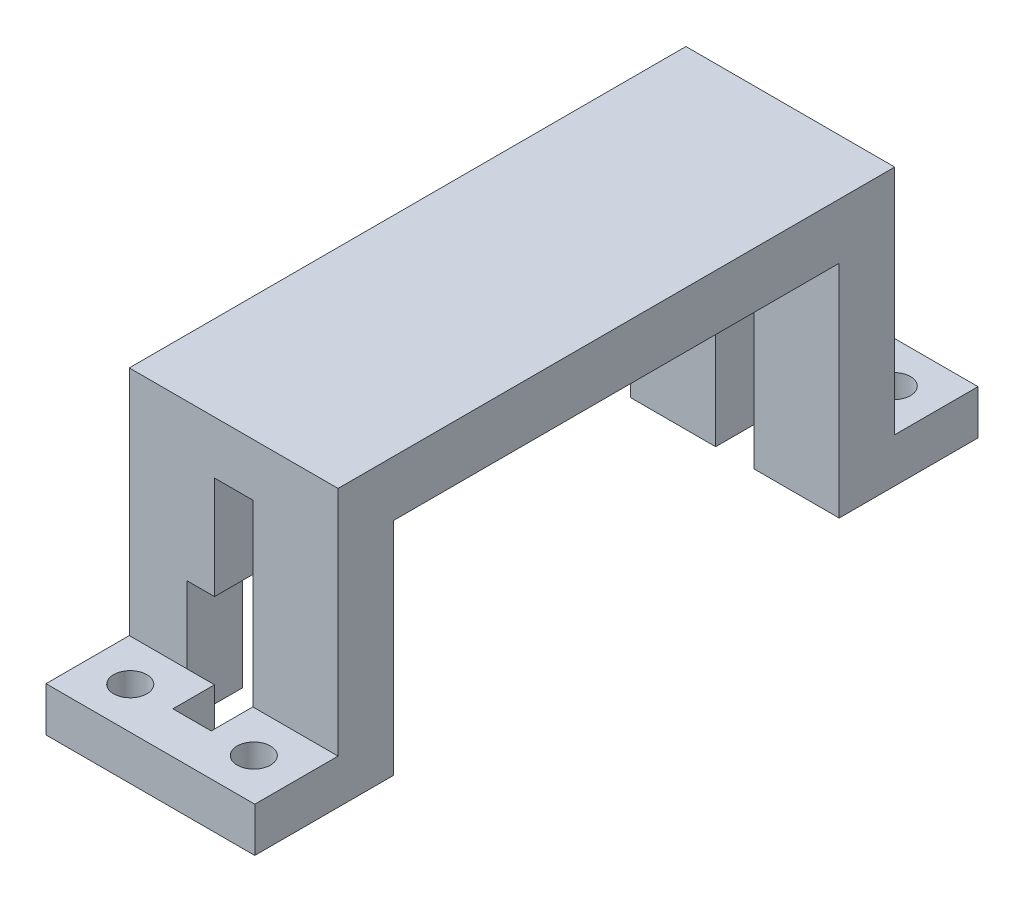
ISO-10303-21;
HEADER;
FILE_DESCRIPTION(('STEP AP214'),'2;1');
FILE_NAME('part.step','',(''),(''),'','','');
FILE_SCHEMA(('AUTOMOTIVE_DESIGN { 1 0 10303 214 1 1 1 1 }'));
ENDSEC;
DATA;
#1=APPLICATION_CONTEXT('core data for automotive mechanical design processes');
#2=APPLICATION_PROTOCOL_DEFINITION('international standard','automotive_design',2000,#1);
#3=PRODUCT_CONTEXT('',#1,'mechanical');
#4=PRODUCT('Part','Part','',(#3));
#5=PRODUCT_RELATED_PRODUCT_CATEGORY('part','',(#4));
#6=PRODUCT_DEFINITION_FORMATION('','',#4);
#7=PRODUCT_DEFINITION_CONTEXT('part definition',#1,'design');
#8=PRODUCT_DEFINITION('design','',#6,#7);
#9=PRODUCT_DEFINITION_SHAPE('','',#8);
#10=(LENGTH_UNIT() NAMED_UNIT(*) SI_UNIT(.MILLI.,.METRE.));
#11=(NAMED_UNIT(*) PLANE_ANGLE_UNIT() SI_UNIT($,.RADIAN.));
#12=(NAMED_UNIT(*) SI_UNIT($,.STERADIAN.) SOLID_ANGLE_UNIT());
#13=UNCERTAINTY_MEASURE_WITH_UNIT(LENGTH_MEASURE(1.E-05),#10,'distance_accuracy_value','');
#14=(GEOMETRIC_REPRESENTATION_CONTEXT(3) GLOBAL_UNCERTAINTY_ASSIGNED_CONTEXT((#13)) GLOBAL_UNIT_ASSIGNED_CONTEXT((#10,
#11,#12)) REPRESENTATION_CONTEXT('',''));
#15=CARTESIAN_POINT('',(0.,0.,0.));
#16=DIRECTION('',(0.,0.,1.));
#17=DIRECTION('',(1.,0.,0.));
#18=AXIS2_PLACEMENT_3D('',#15,#16,#17);
#19=CARTESIAN_POINT('',(7.675,-24.875,-32.5625));
#20=DIRECTION('',(-1.,0.,0.));
#21=DIRECTION('',(0.,0.,1.));
#22=AXIS2_PLACEMENT_3D('',#19,#20,#21);
#23=PLANE('',#22);
#24=DIRECTION('',(0.,0.,1.));
#25=VECTOR('',#24,1.);
#26=CARTESIAN_POINT('',(7.675,-24.875,-32.5625));
#27=LINE('',#26,#25);
#28=CARTESIAN_POINT('',(7.675,-24.875,25.0625));
#29=VERTEX_POINT('',#28);
#30=CARTESIAN_POINT('',(7.675,-24.875,28.8125));
#31=VERTEX_POINT('',#30);
#32=EDGE_CURVE('E416',#29,#31,#27,.T.);
#33=ORIENTED_EDGE('',*,*,#32,.F.);
#34=DIRECTION('',(0.,-1.,0.));
#35=VECTOR('',#34,1.);
#36=CARTESIAN_POINT('',(7.675,-15.75,25.0625));
#37=LINE('',#36,#35);
#38=CARTESIAN_POINT('',(7.675,-20.875,25.0625));
#39=VERTEX_POINT('',#38);
#40=EDGE_CURVE('E234',#39,#29,#37,.T.);
#41=ORIENTED_EDGE('',*,*,#40,.F.);
#42=DIRECTION('',(0.,0.,-1.));
#43=VECTOR('',#42,1.);
#44=CARTESIAN_POINT('',(7.675,-20.875,25.0625));
#45=LINE('',#44,#43);
#46=CARTESIAN_POINT('',(7.675,-20.875,28.8125));
#47=VERTEX_POINT('',#46);
#48=EDGE_CURVE('E312',#47,#39,#45,.T.);
#49=ORIENTED_EDGE('',*,*,#48,.F.);
#50=DIRECTION('',(0.,1.,0.));
#51=VECTOR('',#50,1.);
#52=CARTESIAN_POINT('',(7.675,-20.875,28.8125));
#53=LINE('',#52,#51);
#54=EDGE_CURVE('E504',#31,#47,#53,.T.);
#55=ORIENTED_EDGE('',*,*,#54,.F.);
#56=EDGE_LOOP('',(#33,#41,#49,#55));
#57=FACE_BOUND('',#56,.T.);
#58=ADVANCED_FACE('F43',(#57),#23,.F.);
#59=DIRECTION('',(0.,1.,0.));
#60=VECTOR('',#59,1.);
#61=CARTESIAN_POINT('',(7.675,0.,25.0625));
#62=LINE('',#61,#60);
#63=CARTESIAN_POINT('',(7.675,-14.,25.0625));
#64=VERTEX_POINT('',#63);
#65=CARTESIAN_POINT('',(7.675,-4.75000000000001,25.0625));
#66=VERTEX_POINT('',#65);
#67=EDGE_CURVE('E315',#64,#66,#62,.T.);
#68=ORIENTED_EDGE('',*,*,#67,.F.);
#69=DIRECTION('',(0.,0.,1.));
#70=VECTOR('',#69,1.);
#71=CARTESIAN_POINT('',(7.675,-14.,20.0625));
#72=LINE('',#71,#70);
#73=CARTESIAN_POINT('',(7.675,-14.,20.0625));
#74=VERTEX_POINT('',#73);
#75=EDGE_CURVE('E532',#74,#64,#72,.T.);
#76=ORIENTED_EDGE('',*,*,#75,.F.);
#77=DIRECTION('',(0.,-1.,0.));
#78=VECTOR('',#77,1.);
#79=CARTESIAN_POINT('',(7.675,-24.875,20.0625));
#80=LINE('',#79,#78);
#81=CARTESIAN_POINT('',(7.675,-5.,20.0625));
#82=VERTEX_POINT('',#81);
#83=EDGE_CURVE('E310',#82,#74,#80,.T.);
#84=ORIENTED_EDGE('',*,*,#83,.F.);
#85=DIRECTION('',(0.,0.,1.));
#86=VECTOR('',#85,1.);
#87=CARTESIAN_POINT('',(7.675,-5.,20.0625));
#88=LINE('',#87,#86);
#89=CARTESIAN_POINT('',(7.675,-5.,-20.0625));
#90=VERTEX_POINT('',#89);
#91=EDGE_CURVE('E301',#90,#82,#88,.T.);
#92=ORIENTED_EDGE('',*,*,#91,.F.);
#93=DIRECTION('',(0.,1.,0.));
#94=VECTOR('',#93,1.);
#95=CARTESIAN_POINT('',(7.675,-5.,-20.0625));
#96=LINE('',#95,#94);
#97=CARTESIAN_POINT('',(7.675,-24.875,-20.0625));
#98=VERTEX_POINT('',#97);
#99=EDGE_CURVE('E297',#98,#90,#96,.T.);
#100=ORIENTED_EDGE('',*,*,#99,.F.);
#101=CARTESIAN_POINT('',(7.675,-24.875,-28.8125));
#102=VERTEX_POINT('',#101);
#103=EDGE_CURVE('E412',#102,#98,#27,.T.);
#104=ORIENTED_EDGE('',*,*,#103,.F.);
#105=DIRECTION('',(0.,1.,0.));
#106=VECTOR('',#105,1.);
#107=CARTESIAN_POINT('',(7.675,-20.875,-28.8125));
#108=LINE('',#107,#106);
#109=CARTESIAN_POINT('',(7.675,-20.875,-28.8125));
#110=VERTEX_POINT('',#109);
#111=EDGE_CURVE('E291',#102,#110,#108,.T.);
#112=ORIENTED_EDGE('',*,*,#111,.T.);
#113=DIRECTION('',(0.,0.,-1.));
#114=VECTOR('',#113,1.);
#115=CARTESIAN_POINT('',(7.675,-20.875,-25.0625));
#116=LINE('',#115,#114);
#117=CARTESIAN_POINT('',(7.675,-20.875,-25.0625));
#118=VERTEX_POINT('',#117);
#119=EDGE_CURVE('E51',#118,#110,#116,.T.);
#120=ORIENTED_EDGE('',*,*,#119,.F.);
#121=DIRECTION('',(0.,-1.,0.));
#122=VECTOR('',#121,1.);
#123=CARTESIAN_POINT('',(7.675,-20.875,-25.0625));
#124=LINE('',#123,#122);
#125=CARTESIAN_POINT('',(7.675,-4.75000000000001,-25.0625));
#126=VERTEX_POINT('',#125);
#127=EDGE_CURVE('E287',#126,#118,#124,.T.);
#128=ORIENTED_EDGE('',*,*,#127,.F.);
#129=DIRECTION('',(0.,0.,1.));
#130=VECTOR('',#129,1.);
#131=CARTESIAN_POINT('',(7.675,-4.75000000000001,-32.5625));
#132=LINE('',#131,#130);
#133=EDGE_CURVE('E480',#126,#66,#132,.T.);
#134=ORIENTED_EDGE('',*,*,#133,.T.);
#135=EDGE_LOOP('',(#68,#76,#84,#92,#100,#104,#112,#120,#128,#134));
#136=FACE_BOUND('',#135,.T.);
#137=ADVANCED_FACE('F285',(#136),#23,.F.);
#138=CARTESIAN_POINT('',(11.125,-4.75000000000001,-32.5625));
#139=DIRECTION('',(1.,0.,0.));
#140=DIRECTION('',(0.,1.,0.));
#141=AXIS2_PLACEMENT_3D('',#138,#139,#140);
#142=PLANE('',#141);
#143=DIRECTION('',(0.,0.,1.));
#144=VECTOR('',#143,1.);
#145=CARTESIAN_POINT('',(11.125,-20.875,-25.0625));
#146=LINE('',#145,#144);
#147=CARTESIAN_POINT('',(11.125,-20.875,-28.8125));
#148=VERTEX_POINT('',#147);
#149=CARTESIAN_POINT('',(11.125,-20.875,-25.0625));
#150=VERTEX_POINT('',#149);
#151=EDGE_CURVE('E275',#148,#150,#146,.T.);
#152=ORIENTED_EDGE('',*,*,#151,.F.);
#153=DIRECTION('',(0.,1.,0.));
#154=VECTOR('',#153,1.);
#155=CARTESIAN_POINT('',(11.125,-20.875,-28.8125));
#156=LINE('',#155,#154);
#157=CARTESIAN_POINT('',(11.125,-24.875,-28.8125));
#158=VERTEX_POINT('',#157);
#159=EDGE_CURVE('E522',#158,#148,#156,.T.);
#160=ORIENTED_EDGE('',*,*,#159,.F.);
#161=DIRECTION('',(0.,0.,1.));
#162=VECTOR('',#161,1.);
#163=CARTESIAN_POINT('',(11.125,-24.875,-32.5625));
#164=LINE('',#163,#162);
#165=CARTESIAN_POINT('',(11.125,-24.875,-20.0625));
#166=VERTEX_POINT('',#165);
#167=EDGE_CURVE('E452',#158,#166,#164,.T.);
#168=ORIENTED_EDGE('',*,*,#167,.T.);
#169=DIRECTION('',(0.,-1.,0.));
#170=VECTOR('',#169,1.);
#171=CARTESIAN_POINT('',(11.125,-5.,-20.0625));
#172=LINE('',#171,#170);
#173=CARTESIAN_POINT('',(11.125,-5.,-20.0625));
#174=VERTEX_POINT('',#173);
#175=EDGE_CURVE('E454',#174,#166,#172,.T.);
#176=ORIENTED_EDGE('',*,*,#175,.F.);
#177=DIRECTION('',(0.,0.,-1.));
#178=VECTOR('',#177,1.);
#179=CARTESIAN_POINT('',(11.125,-5.,20.0625));
#180=LINE('',#179,#178);
#181=CARTESIAN_POINT('',(11.125,-5.,20.0625));
#182=VERTEX_POINT('',#181);
#183=EDGE_CURVE('E457',#182,#174,#180,.T.);
#184=ORIENTED_EDGE('',*,*,#183,.F.);
#185=DIRECTION('',(0.,1.,0.));
#186=VECTOR('',#185,1.);
#187=CARTESIAN_POINT('',(11.125,-24.875,20.0625));
#188=LINE('',#187,#186);
#189=CARTESIAN_POINT('',(11.125,-24.875,20.0625));
#190=VERTEX_POINT('',#189);
#191=EDGE_CURVE('E459',#190,#182,#188,.T.);
#192=ORIENTED_EDGE('',*,*,#191,.F.);
#193=CARTESIAN_POINT('',(11.125,-24.875,28.8125));
#194=VERTEX_POINT('',#193);
#195=EDGE_CURVE('E485',#190,#194,#164,.T.);
#196=ORIENTED_EDGE('',*,*,#195,.T.);
#197=DIRECTION('',(0.,1.,0.));
#198=VECTOR('',#197,1.);
#199=CARTESIAN_POINT('',(11.125,-20.875,28.8125));
#200=LINE('',#199,#198);
#201=CARTESIAN_POINT('',(11.125,-20.875,28.8125));
#202=VERTEX_POINT('',#201);
#203=EDGE_CURVE('E475',#194,#202,#200,.T.);
#204=ORIENTED_EDGE('',*,*,#203,.T.);
#205=DIRECTION('',(0.,0.,1.));
#206=VECTOR('',#205,1.);
#207=CARTESIAN_POINT('',(11.125,-20.875,25.0625));
#208=LINE('',#207,#206);
#209=CARTESIAN_POINT('',(11.125,-20.875,25.0625));
#210=VERTEX_POINT('',#209);
#211=EDGE_CURVE('E304',#210,#202,#208,.T.);
#212=ORIENTED_EDGE('',*,*,#211,.F.);
#213=DIRECTION('',(0.,-1.,0.));
#214=VECTOR('',#213,1.);
#215=CARTESIAN_POINT('',(11.125,0.,25.0625));
#216=LINE('',#215,#214);
#217=CARTESIAN_POINT('',(11.125,-4.75000000000001,25.0625));
#218=VERTEX_POINT('',#217);
#219=EDGE_CURVE('E298',#218,#210,#216,.T.);
#220=ORIENTED_EDGE('',*,*,#219,.F.);
#221=DIRECTION('',(0.,0.,1.));
#222=VECTOR('',#221,1.);
#223=CARTESIAN_POINT('',(11.125,-4.75000000000001,-32.5625));
#224=LINE('',#223,#222);
#225=CARTESIAN_POINT('',(11.125,-4.75000000000001,-25.0625));
#226=VERTEX_POINT('',#225);
#227=EDGE_CURVE('E481',#226,#218,#224,.T.);
#228=ORIENTED_EDGE('',*,*,#227,.F.);
#229=DIRECTION('',(0.,1.,0.));
#230=VECTOR('',#229,1.);
#231=CARTESIAN_POINT('',(11.125,-20.875,-25.0625));
#232=LINE('',#231,#230);
#233=EDGE_CURVE('E415',#150,#226,#232,.T.);
#234=ORIENTED_EDGE('',*,*,#233,.F.);
#235=EDGE_LOOP('',(#152,#160,#168,#176,#184,#192,#196,#204,#212,#220,#228,#234));
#236=FACE_BOUND('',#235,.T.);
#237=ADVANCED_FACE('F471',(#236),#142,.F.);
#238=CARTESIAN_POINT('',(18.8,-24.875,20.0625));
#239=DIRECTION('',(0.,0.,1.));
#240=DIRECTION('',(0.,-1.,0.));
#241=AXIS2_PLACEMENT_3D('',#238,#239,#240);
#242=PLANE('',#241);
#243=ORIENTED_EDGE('',*,*,#83,.T.);
#244=DIRECTION('',(1.,0.,0.));
#245=VECTOR('',#244,1.);
#246=CARTESIAN_POINT('',(5.175,-14.,20.0625));
#247=LINE('',#246,#245);
#248=CARTESIAN_POINT('',(5.175,-14.,20.0625));
#249=VERTEX_POINT('',#248);
#250=EDGE_CURVE('E243',#249,#74,#247,.T.);
#251=ORIENTED_EDGE('',*,*,#250,.F.);
#252=DIRECTION('',(0.,1.,0.));
#253=VECTOR('',#252,1.);
#254=CARTESIAN_POINT('',(5.175,-24.875,20.0625));
#255=LINE('',#254,#253);
#256=CARTESIAN_POINT('',(5.175,-24.875,20.0625));
#257=VERTEX_POINT('',#256);
#258=EDGE_CURVE('E228',#257,#249,#255,.T.);
#259=ORIENTED_EDGE('',*,*,#258,.F.);
#260=DIRECTION('',(-1.,0.,0.));
#261=VECTOR('',#260,1.);
#262=CARTESIAN_POINT('',(18.8,-24.875,20.0625));
#263=LINE('',#262,#261);
#264=CARTESIAN_POINT('',(0.,-24.875,20.0625));
#265=VERTEX_POINT('',#264);
#266=EDGE_CURVE('E241',#257,#265,#263,.T.);
#267=ORIENTED_EDGE('',*,*,#266,.T.);
#268=DIRECTION('',(0.,1.,0.));
#269=VECTOR('',#268,1.);
#270=CARTESIAN_POINT('',(0.,-24.875,20.0625));
#271=LINE('',#270,#269);
#272=CARTESIAN_POINT('',(0.,-5.,20.0625));
#273=VERTEX_POINT('',#272);
#274=EDGE_CURVE('E358',#265,#273,#271,.T.);
#275=ORIENTED_EDGE('',*,*,#274,.T.);
#276=DIRECTION('',(-1.,0.,0.));
#277=VECTOR('',#276,1.);
#278=CARTESIAN_POINT('',(18.8,-5.,20.0625));
#279=LINE('',#278,#277);
#280=EDGE_CURVE('E257',#82,#273,#279,.T.);
#281=ORIENTED_EDGE('',*,*,#280,.F.);
#282=EDGE_LOOP('',(#243,#251,#259,#267,#275,#281));
#283=FACE_BOUND('',#282,.T.);
#284=ADVANCED_FACE('F239',(#283),#242,.F.);
#285=CARTESIAN_POINT('',(18.8,-5.,20.0625));
#286=DIRECTION('',(0.,1.,0.));
#287=DIRECTION('',(0.,0.,1.));
#288=AXIS2_PLACEMENT_3D('',#285,#286,#287);
#289=PLANE('',#288);
#290=DIRECTION('',(-1.,0.,0.));
#291=VECTOR('',#290,1.);
#292=CARTESIAN_POINT('',(18.8,-5.,-20.0625));
#293=LINE('',#292,#291);
#294=CARTESIAN_POINT('',(0.,-5.,-20.0625));
#295=VERTEX_POINT('',#294);
#296=EDGE_CURVE('E383',#90,#295,#293,.T.);
#297=ORIENTED_EDGE('',*,*,#296,.F.);
#298=ORIENTED_EDGE('',*,*,#91,.T.);
#299=ORIENTED_EDGE('',*,*,#280,.T.);
#300=DIRECTION('',(0.,0.,-1.));
#301=VECTOR('',#300,1.);
#302=CARTESIAN_POINT('',(0.,-5.,20.0625));
#303=LINE('',#302,#301);
#304=EDGE_CURVE('E360',#273,#295,#303,.T.);
#305=ORIENTED_EDGE('',*,*,#304,.T.);
#306=EDGE_LOOP('',(#297,#298,#299,#305));
#307=FACE_BOUND('',#306,.T.);
#308=ADVANCED_FACE('F398',(#307),#289,.F.);
#309=CARTESIAN_POINT('',(18.8,-5.,-20.0625));
#310=DIRECTION('',(0.,0.,-1.));
#311=DIRECTION('',(0.,1.,0.));
#312=AXIS2_PLACEMENT_3D('',#309,#310,#311);
#313=PLANE('',#312);
#314=DIRECTION('',(-1.,0.,0.));
#315=VECTOR('',#314,1.);
#316=CARTESIAN_POINT('',(18.8,-24.875,-20.0625));
#317=LINE('',#316,#315);
#318=CARTESIAN_POINT('',(0.,-24.875,-20.0625));
#319=VERTEX_POINT('',#318);
#320=EDGE_CURVE('E380',#98,#319,#317,.T.);
#321=ORIENTED_EDGE('',*,*,#320,.F.);
#322=ORIENTED_EDGE('',*,*,#99,.T.);
#323=ORIENTED_EDGE('',*,*,#296,.T.);
#324=DIRECTION('',(0.,-1.,0.));
#325=VECTOR('',#324,1.);
#326=CARTESIAN_POINT('',(0.,-5.,-20.0625));
#327=LINE('',#326,#325);
#328=EDGE_CURVE('E363',#295,#319,#327,.T.);
#329=ORIENTED_EDGE('',*,*,#328,.T.);
#330=EDGE_LOOP('',(#321,#322,#323,#329));
#331=FACE_BOUND('',#330,.T.);
#332=ADVANCED_FACE('F393',(#331),#313,.F.);
#333=CARTESIAN_POINT('',(18.8,-20.875,-25.0625));
#334=DIRECTION('',(0.,0.,1.));
#335=DIRECTION('',(0.,-1.,0.));
#336=AXIS2_PLACEMENT_3D('',#333,#334,#335);
#337=PLANE('',#336);
#338=DIRECTION('',(-1.,0.,0.));
#339=VECTOR('',#338,1.);
#340=CARTESIAN_POINT('',(18.8,-4.75000000000001,-25.0625));
#341=LINE('',#340,#339);
#342=EDGE_CURVE('E296',#226,#126,#341,.T.);
#343=ORIENTED_EDGE('',*,*,#342,.T.);
#344=ORIENTED_EDGE('',*,*,#127,.T.);
#345=DIRECTION('',(-1.,0.,0.));
#346=VECTOR('',#345,1.);
#347=CARTESIAN_POINT('',(18.8,-20.875,-25.0625));
#348=LINE('',#347,#346);
#349=CARTESIAN_POINT('',(0.,-20.875,-25.0625));
#350=VERTEX_POINT('',#349);
#351=EDGE_CURVE('E280',#118,#350,#348,.T.);
#352=ORIENTED_EDGE('',*,*,#351,.T.);
#353=DIRECTION('',(0.,1.,0.));
#354=VECTOR('',#353,1.);
#355=CARTESIAN_POINT('',(0.,-20.875,-25.0625));
#356=LINE('',#355,#354);
#357=CARTESIAN_POINT('',(0.,0.,-25.0625));
#358=VERTEX_POINT('',#357);
#359=EDGE_CURVE('E318',#350,#358,#356,.T.);
#360=ORIENTED_EDGE('',*,*,#359,.T.);
#361=DIRECTION('',(-1.,0.,0.));
#362=VECTOR('',#361,1.);
#363=CARTESIAN_POINT('',(18.8,0.,-25.0625));
#364=LINE('',#363,#362);
#365=CARTESIAN_POINT('',(18.8,0.,-25.0625));
#366=VERTEX_POINT('',#365);
#367=EDGE_CURVE('E272',#366,#358,#364,.T.);
#368=ORIENTED_EDGE('',*,*,#367,.F.);
#369=DIRECTION('',(0.,1.,0.));
#370=VECTOR('',#369,1.);
#371=CARTESIAN_POINT('',(18.8,-20.875,-25.0625));
#372=LINE('',#371,#370);
#373=CARTESIAN_POINT('',(18.8,-20.875,-25.0625));
#374=VERTEX_POINT('',#373);
#375=EDGE_CURVE('E319',#374,#366,#372,.T.);
#376=ORIENTED_EDGE('',*,*,#375,.F.);
#377=EDGE_CURVE('E373',#374,#150,#348,.T.);
#378=ORIENTED_EDGE('',*,*,#377,.T.);
#379=ORIENTED_EDGE('',*,*,#233,.T.);
#380=EDGE_LOOP('',(#343,#344,#352,#360,#368,#376,#378,#379));
#381=FACE_BOUND('',#380,.T.);
#382=ADVANCED_FACE('F45',(#381),#337,.F.);
#383=CARTESIAN_POINT('',(18.8,0.,25.0625));
#384=DIRECTION('',(0.,-1.,0.));
#385=DIRECTION('',(0.,0.,-1.));
#386=AXIS2_PLACEMENT_3D('',#383,#384,#385);
#387=PLANE('',#386);
#388=DIRECTION('',(0.,0.,1.));
#389=VECTOR('',#388,1.);
#390=CARTESIAN_POINT('',(0.,0.,25.0625));
#391=LINE('',#390,#389);
#392=CARTESIAN_POINT('',(0.,0.,25.0625));
#393=VERTEX_POINT('',#392);
#394=EDGE_CURVE('E346',#358,#393,#391,.T.);
#395=ORIENTED_EDGE('',*,*,#394,.T.);
#396=DIRECTION('',(-1.,0.,0.));
#397=VECTOR('',#396,1.);
#398=CARTESIAN_POINT('',(18.8,0.,25.0625));
#399=LINE('',#398,#397);
#400=CARTESIAN_POINT('',(18.8,0.,25.0625));
#401=VERTEX_POINT('',#400);
#402=EDGE_CURVE('E268',#401,#393,#399,.T.);
#403=ORIENTED_EDGE('',*,*,#402,.F.);
#404=DIRECTION('',(0.,0.,1.));
#405=VECTOR('',#404,1.);
#406=CARTESIAN_POINT('',(18.8,0.,25.0625));
#407=LINE('',#406,#405);
#408=EDGE_CURVE('E322',#366,#401,#407,.T.);
#409=ORIENTED_EDGE('',*,*,#408,.F.);
#410=ORIENTED_EDGE('',*,*,#367,.T.);
#411=EDGE_LOOP('',(#395,#403,#409,#410));
#412=FACE_BOUND('',#411,.T.);
#413=ADVANCED_FACE('F441',(#412),#387,.F.);
#414=CARTESIAN_POINT('',(18.8,0.,25.0625));
#415=DIRECTION('',(0.,0.,-1.));
#416=DIRECTION('',(0.,1.,0.));
#417=AXIS2_PLACEMENT_3D('',#414,#415,#416);
#418=PLANE('',#417);
#419=DIRECTION('',(0.,-1.,0.));
#420=VECTOR('',#419,1.);
#421=CARTESIAN_POINT('',(5.175,-14.,25.0625));
#422=LINE('',#421,#420);
#423=CARTESIAN_POINT('',(5.175,-14.,25.0625));
#424=VERTEX_POINT('',#423);
#425=CARTESIAN_POINT('',(5.175,-20.875,25.0625));
#426=VERTEX_POINT('',#425);
#427=EDGE_CURVE('E528',#424,#426,#422,.T.);
#428=ORIENTED_EDGE('',*,*,#427,.F.);
#429=DIRECTION('',(1.,0.,0.));
#430=VECTOR('',#429,1.);
#431=CARTESIAN_POINT('',(5.175,-14.,25.0625));
#432=LINE('',#431,#430);
#433=EDGE_CURVE('E527',#424,#64,#432,.T.);
#434=ORIENTED_EDGE('',*,*,#433,.T.);
#435=ORIENTED_EDGE('',*,*,#67,.T.);
#436=DIRECTION('',(1.,0.,0.));
#437=VECTOR('',#436,1.);
#438=CARTESIAN_POINT('',(18.8,-4.75000000000001,25.0625));
#439=LINE('',#438,#437);
#440=EDGE_CURVE('E11',#66,#218,#439,.T.);
#441=ORIENTED_EDGE('',*,*,#440,.T.);
#442=ORIENTED_EDGE('',*,*,#219,.T.);
#443=DIRECTION('',(-1.,0.,0.));
#444=VECTOR('',#443,1.);
#445=CARTESIAN_POINT('',(18.8,-20.875,25.0625));
#446=LINE('',#445,#444);
#447=CARTESIAN_POINT('',(18.8,-20.875,25.0625));
#448=VERTEX_POINT('',#447);
#449=EDGE_CURVE('E265',#448,#210,#446,.T.);
#450=ORIENTED_EDGE('',*,*,#449,.F.);
#451=DIRECTION('',(0.,-1.,0.));
#452=VECTOR('',#451,1.);
#453=CARTESIAN_POINT('',(18.8,0.,25.0625));
#454=LINE('',#453,#452);
#455=EDGE_CURVE('E325',#401,#448,#454,.T.);
#456=ORIENTED_EDGE('',*,*,#455,.F.);
#457=ORIENTED_EDGE('',*,*,#402,.T.);
#458=DIRECTION('',(0.,-1.,0.));
#459=VECTOR('',#458,1.);
#460=CARTESIAN_POINT('',(0.,0.,25.0625));
#461=LINE('',#460,#459);
#462=CARTESIAN_POINT('',(0.,-20.875,25.0625));
#463=VERTEX_POINT('',#462);
#464=EDGE_CURVE('E348',#393,#463,#461,.T.);
#465=ORIENTED_EDGE('',*,*,#464,.T.);
#466=EDGE_CURVE('E264',#426,#463,#446,.T.);
#467=ORIENTED_EDGE('',*,*,#466,.F.);
#468=EDGE_LOOP('',(#428,#434,#435,#441,#442,#450,#456,#457,#465,#467));
#469=FACE_BOUND('',#468,.T.);
#470=ADVANCED_FACE('F436',(#469),#418,.F.);
#471=CARTESIAN_POINT('',(18.8,-20.875,25.0625));
#472=DIRECTION('',(0.,-1.,0.));
#473=DIRECTION('',(0.,0.,-1.));
#474=AXIS2_PLACEMENT_3D('',#471,#472,#473);
#475=PLANE('',#474);
#476=CARTESIAN_POINT('',(14.9625,-20.875,28.8125));
#477=DIRECTION('',(0.,1.,0.));
#478=DIRECTION('',(0.,0.,1.));
#479=AXIS2_PLACEMENT_3D('',#476,#477,#478);
#480=CIRCLE('',#479,1.5);
#481=CARTESIAN_POINT('',(14.9625,-20.875,30.3125));
#482=VERTEX_POINT('',#481);
#483=EDGE_CURVE('E494',#482,#482,#480,.T.);
#484=ORIENTED_EDGE('',*,*,#483,.F.);
#485=EDGE_LOOP('',(#484));
#486=FACE_BOUND('',#485,.T.);
#487=ORIENTED_EDGE('',*,*,#449,.T.);
#488=ORIENTED_EDGE('',*,*,#211,.T.);
#489=DIRECTION('',(-1.,0.,0.));
#490=VECTOR('',#489,1.);
#491=CARTESIAN_POINT('',(18.802,-20.875,28.8125));
#492=LINE('',#491,#490);
#493=EDGE_CURVE('E467',#202,#47,#492,.T.);
#494=ORIENTED_EDGE('',*,*,#493,.T.);
#495=ORIENTED_EDGE('',*,*,#48,.T.);
#496=EDGE_CURVE('E269',#39,#426,#446,.T.);
#497=ORIENTED_EDGE('',*,*,#496,.T.);
#498=ORIENTED_EDGE('',*,*,#466,.T.);
#499=DIRECTION('',(0.,0.,1.));
#500=VECTOR('',#499,1.);
#501=CARTESIAN_POINT('',(0.,-20.875,25.0625));
#502=LINE('',#501,#500);
#503=CARTESIAN_POINT('',(0.,-20.875,32.5625));
#504=VERTEX_POINT('',#503);
#505=EDGE_CURVE('E351',#463,#504,#502,.T.);
#506=ORIENTED_EDGE('',*,*,#505,.T.);
#507=DIRECTION('',(-1.,0.,0.));
#508=VECTOR('',#507,1.);
#509=CARTESIAN_POINT('',(18.8,-20.875,32.5625));
#510=LINE('',#509,#508);
#511=CARTESIAN_POINT('',(18.8,-20.875,32.5625));
#512=VERTEX_POINT('',#511);
#513=EDGE_CURVE('E262',#512,#504,#510,.T.);
#514=ORIENTED_EDGE('',*,*,#513,.F.);
#515=DIRECTION('',(0.,0.,1.));
#516=VECTOR('',#515,1.);
#517=CARTESIAN_POINT('',(18.8,-20.875,25.0625));
#518=LINE('',#517,#516);
#519=EDGE_CURVE('E327',#448,#512,#518,.T.);
#520=ORIENTED_EDGE('',*,*,#519,.F.);
#521=EDGE_LOOP('',(#487,#488,#494,#495,#497,#498,#506,#514,#520));
#522=FACE_BOUND('',#521,.T.);
#523=CARTESIAN_POINT('',(3.8375,-20.875,28.8125));
#524=DIRECTION('',(0.,1.,0.));
#525=DIRECTION('',(0.,0.,1.));
#526=AXIS2_PLACEMENT_3D('',#523,#524,#525);
#527=CIRCLE('',#526,1.5);
#528=CARTESIAN_POINT('',(3.8375,-20.875,30.3125));
#529=VERTEX_POINT('',#528);
#530=EDGE_CURVE('E490',#529,#529,#527,.T.);
#531=ORIENTED_EDGE('',*,*,#530,.F.);
#532=EDGE_LOOP('',(#531));
#533=FACE_BOUND('',#532,.T.);
#534=ADVANCED_FACE('F429',(#486,#522,#533),#475,.F.);
#535=CARTESIAN_POINT('',(18.8,-24.875,32.5625));
#536=DIRECTION('',(0.,0.,-1.));
#537=DIRECTION('',(0.,1.,0.));
#538=AXIS2_PLACEMENT_3D('',#535,#536,#537);
#539=PLANE('',#538);
#540=ORIENTED_EDGE('',*,*,#513,.T.);
#541=DIRECTION('',(0.,-1.,0.));
#542=VECTOR('',#541,1.);
#543=CARTESIAN_POINT('',(0.,-24.875,32.5625));
#544=LINE('',#543,#542);
#545=CARTESIAN_POINT('',(0.,-24.875,32.5625));
#546=VERTEX_POINT('',#545);
#547=EDGE_CURVE('E354',#504,#546,#544,.T.);
#548=ORIENTED_EDGE('',*,*,#547,.T.);
#549=DIRECTION('',(-1.,0.,0.));
#550=VECTOR('',#549,1.);
#551=CARTESIAN_POINT('',(18.8,-24.875,32.5625));
#552=LINE('',#551,#550);
#553=CARTESIAN_POINT('',(18.8,-24.875,32.5625));
#554=VERTEX_POINT('',#553);
#555=EDGE_CURVE('E255',#554,#546,#552,.T.);
#556=ORIENTED_EDGE('',*,*,#555,.F.);
#557=DIRECTION('',(0.,-1.,0.));
#558=VECTOR('',#557,1.);
#559=CARTESIAN_POINT('',(18.8,-24.875,32.5625));
#560=LINE('',#559,#558);
#561=EDGE_CURVE('E329',#512,#554,#560,.T.);
#562=ORIENTED_EDGE('',*,*,#561,.F.);
#563=EDGE_LOOP('',(#540,#548,#556,#562));
#564=FACE_BOUND('',#563,.T.);
#565=ADVANCED_FACE('F423',(#564),#539,.F.);
#566=CARTESIAN_POINT('',(18.8,-24.875,25.0625));
#567=DIRECTION('',(0.,1.,0.));
#568=DIRECTION('',(0.,0.,1.));
#569=AXIS2_PLACEMENT_3D('',#566,#567,#568);
#570=PLANE('',#569);
#571=CARTESIAN_POINT('',(14.9625,-24.875,28.8125));
#572=DIRECTION('',(0.,1.,0.));
#573=DIRECTION('',(0.,0.,1.));
#574=AXIS2_PLACEMENT_3D('',#571,#572,#573);
#575=CIRCLE('',#574,1.5);
#576=CARTESIAN_POINT('',(14.9625,-24.875,30.3125));
#577=VERTEX_POINT('',#576);
#578=EDGE_CURVE('E508',#577,#577,#575,.F.);
#579=ORIENTED_EDGE('',*,*,#578,.F.);
#580=EDGE_LOOP('',(#579));
#581=FACE_BOUND('',#580,.T.);
#582=DIRECTION('',(0.,0.,-1.));
#583=VECTOR('',#582,1.);
#584=CARTESIAN_POINT('',(5.175,-24.875,25.0625));
#585=LINE('',#584,#583);
#586=CARTESIAN_POINT('',(5.175,-24.875,25.0625));
#587=VERTEX_POINT('',#586);
#588=EDGE_CURVE('E224',#587,#257,#585,.T.);
#589=ORIENTED_EDGE('',*,*,#588,.F.);
#590=DIRECTION('',(1.,0.,0.));
#591=VECTOR('',#590,1.);
#592=CARTESIAN_POINT('',(5.175,-24.875,25.0625));
#593=LINE('',#592,#591);
#594=EDGE_CURVE('E58',#587,#29,#593,.T.);
#595=ORIENTED_EDGE('',*,*,#594,.T.);
#596=ORIENTED_EDGE('',*,*,#32,.T.);
#597=DIRECTION('',(-1.,0.,0.));
#598=VECTOR('',#597,1.);
#599=CARTESIAN_POINT('',(18.802,-24.875,28.8125));
#600=LINE('',#599,#598);
#601=EDGE_CURVE('E516',#194,#31,#600,.T.);
#602=ORIENTED_EDGE('',*,*,#601,.F.);
#603=ORIENTED_EDGE('',*,*,#195,.F.);
#604=CARTESIAN_POINT('',(18.8,-24.875,20.0625));
#605=VERTEX_POINT('',#604);
#606=EDGE_CURVE('E251',#605,#190,#263,.T.);
#607=ORIENTED_EDGE('',*,*,#606,.F.);
#608=DIRECTION('',(0.,0.,-1.));
#609=VECTOR('',#608,1.);
#610=CARTESIAN_POINT('',(18.8,-24.875,25.0625));
#611=LINE('',#610,#609);
#612=EDGE_CURVE('E331',#554,#605,#611,.T.);
#613=ORIENTED_EDGE('',*,*,#612,.F.);
#614=ORIENTED_EDGE('',*,*,#555,.T.);
#615=DIRECTION('',(0.,0.,-1.));
#616=VECTOR('',#615,1.);
#617=CARTESIAN_POINT('',(0.,-24.875,25.0625));
#618=LINE('',#617,#616);
#619=EDGE_CURVE('E249',#546,#265,#618,.T.);
#620=ORIENTED_EDGE('',*,*,#619,.T.);
#621=ORIENTED_EDGE('',*,*,#266,.F.);
#622=EDGE_LOOP('',(#589,#595,#596,#602,#603,#607,#613,#614,#620,#621));
#623=FACE_BOUND('',#622,.T.);
#624=CARTESIAN_POINT('',(3.8375,-24.875,28.8125));
#625=DIRECTION('',(0.,1.,0.));
#626=DIRECTION('',(0.,0.,1.));
#627=AXIS2_PLACEMENT_3D('',#624,#625,#626);
#628=CIRCLE('',#627,1.5);
#629=CARTESIAN_POINT('',(3.8375,-24.875,30.3125));
#630=VERTEX_POINT('',#629);
#631=EDGE_CURVE('E487',#630,#630,#628,.F.);
#632=ORIENTED_EDGE('',*,*,#631,.F.);
#633=EDGE_LOOP('',(#632));
#634=FACE_BOUND('',#633,.T.);
#635=ADVANCED_FACE('F246',(#581,#623,#634),#570,.F.);
#636=ORIENTED_EDGE('',*,*,#606,.T.);
#637=ORIENTED_EDGE('',*,*,#191,.T.);
#638=CARTESIAN_POINT('',(18.8,-5.,20.0625));
#639=VERTEX_POINT('',#638);
#640=EDGE_CURVE('E252',#639,#182,#279,.T.);
#641=ORIENTED_EDGE('',*,*,#640,.F.);
#642=DIRECTION('',(0.,1.,0.));
#643=VECTOR('',#642,1.);
#644=CARTESIAN_POINT('',(18.8,-24.875,20.0625));
#645=LINE('',#644,#643);
#646=EDGE_CURVE('E333',#605,#639,#645,.T.);
#647=ORIENTED_EDGE('',*,*,#646,.F.);
#648=EDGE_LOOP('',(#636,#637,#641,#647));
#649=FACE_BOUND('',#648,.T.);
#650=ADVANCED_FACE('F582',(#649),#242,.F.);
#651=ORIENTED_EDGE('',*,*,#640,.T.);
#652=ORIENTED_EDGE('',*,*,#183,.T.);
#653=CARTESIAN_POINT('',(18.8,-5.,-20.0625));
#654=VERTEX_POINT('',#653);
#655=EDGE_CURVE('E384',#654,#174,#293,.T.);
#656=ORIENTED_EDGE('',*,*,#655,.F.);
#657=DIRECTION('',(0.,0.,-1.));
#658=VECTOR('',#657,1.);
#659=CARTESIAN_POINT('',(18.8,-5.,20.0625));
#660=LINE('',#659,#658);
#661=EDGE_CURVE('E335',#639,#654,#660,.T.);
#662=ORIENTED_EDGE('',*,*,#661,.F.);
#663=EDGE_LOOP('',(#651,#652,#656,#662));
#664=FACE_BOUND('',#663,.T.);
#665=ADVANCED_FACE('F579',(#664),#289,.F.);
#666=ORIENTED_EDGE('',*,*,#655,.T.);
#667=ORIENTED_EDGE('',*,*,#175,.T.);
#668=CARTESIAN_POINT('',(18.8,-24.875,-20.0625));
#669=VERTEX_POINT('',#668);
#670=EDGE_CURVE('E381',#669,#166,#317,.T.);
#671=ORIENTED_EDGE('',*,*,#670,.F.);
#672=DIRECTION('',(0.,-1.,0.));
#673=VECTOR('',#672,1.);
#674=CARTESIAN_POINT('',(18.8,-5.,-20.0625));
#675=LINE('',#674,#673);
#676=EDGE_CURVE('E337',#654,#669,#675,.T.);
#677=ORIENTED_EDGE('',*,*,#676,.F.);
#678=EDGE_LOOP('',(#666,#667,#671,#677));
#679=FACE_BOUND('',#678,.T.);
#680=ADVANCED_FACE('F453',(#679),#313,.F.);
#681=CARTESIAN_POINT('',(18.8,-24.875,-25.0625));
#682=DIRECTION('',(0.,1.,0.));
#683=DIRECTION('',(0.,0.,1.));
#684=AXIS2_PLACEMENT_3D('',#681,#682,#683);
#685=PLANE('',#684);
#686=CARTESIAN_POINT('',(14.9625,-24.875,-28.8125));
#687=DIRECTION('',(0.,1.,0.));
#688=DIRECTION('',(0.,0.,1.));
#689=AXIS2_PLACEMENT_3D('',#686,#687,#688);
#690=CIRCLE('',#689,1.5);
#691=CARTESIAN_POINT('',(14.9625,-24.875,-27.3125));
#692=VERTEX_POINT('',#691);
#693=EDGE_CURVE('E500',#692,#692,#690,.F.);
#694=ORIENTED_EDGE('',*,*,#693,.F.);
#695=EDGE_LOOP('',(#694));
#696=FACE_BOUND('',#695,.T.);
#697=ORIENTED_EDGE('',*,*,#670,.T.);
#698=ORIENTED_EDGE('',*,*,#167,.F.);
#699=DIRECTION('',(-1.,0.,0.));
#700=VECTOR('',#699,1.);
#701=CARTESIAN_POINT('',(18.802,-24.875,-28.8125));
#702=LINE('',#701,#700);
#703=EDGE_CURVE('E414',#158,#102,#702,.T.);
#704=ORIENTED_EDGE('',*,*,#703,.T.);
#705=ORIENTED_EDGE('',*,*,#103,.T.);
#706=ORIENTED_EDGE('',*,*,#320,.T.);
#707=DIRECTION('',(0.,0.,-1.));
#708=VECTOR('',#707,1.);
#709=CARTESIAN_POINT('',(0.,-24.875,-25.0625));
#710=LINE('',#709,#708);
#711=CARTESIAN_POINT('',(0.,-24.875,-32.5625));
#712=VERTEX_POINT('',#711);
#713=EDGE_CURVE('E366',#319,#712,#710,.T.);
#714=ORIENTED_EDGE('',*,*,#713,.T.);
#715=DIRECTION('',(-1.,0.,0.));
#716=VECTOR('',#715,1.);
#717=CARTESIAN_POINT('',(18.8,-24.875,-32.5625));
#718=LINE('',#717,#716);
#719=CARTESIAN_POINT('',(18.8,-24.875,-32.5625));
#720=VERTEX_POINT('',#719);
#721=EDGE_CURVE('E378',#720,#712,#718,.T.);
#722=ORIENTED_EDGE('',*,*,#721,.F.);
#723=DIRECTION('',(0.,0.,-1.));
#724=VECTOR('',#723,1.);
#725=CARTESIAN_POINT('',(18.8,-24.875,-20.0625));
#726=LINE('',#725,#724);
#727=EDGE_CURVE('E339',#669,#720,#726,.T.);
#728=ORIENTED_EDGE('',*,*,#727,.F.);
#729=EDGE_LOOP('',(#697,#698,#704,#705,#706,#714,#722,#728));
#730=FACE_BOUND('',#729,.T.);
#731=CARTESIAN_POINT('',(3.83750000000001,-24.875,-28.8125));
#732=DIRECTION('',(0.,1.,0.));
#733=DIRECTION('',(0.,0.,1.));
#734=AXIS2_PLACEMENT_3D('',#731,#732,#733);
#735=CIRCLE('',#734,1.5);
#736=CARTESIAN_POINT('',(3.83750000000001,-24.875,-27.3125));
#737=VERTEX_POINT('',#736);
#738=EDGE_CURVE('E501',#737,#737,#735,.F.);
#739=ORIENTED_EDGE('',*,*,#738,.F.);
#740=EDGE_LOOP('',(#739));
#741=FACE_BOUND('',#740,.T.);
#742=ADVANCED_FACE('F408',(#696,#730,#741),#685,.F.);
#743=CARTESIAN_POINT('',(18.8,-24.875,-32.5625));
#744=DIRECTION('',(0.,0.,1.));
#745=DIRECTION('',(0.,-1.,0.));
#746=AXIS2_PLACEMENT_3D('',#743,#744,#745);
#747=PLANE('',#746);
#748=ORIENTED_EDGE('',*,*,#721,.T.);
#749=DIRECTION('',(0.,1.,0.));
#750=VECTOR('',#749,1.);
#751=CARTESIAN_POINT('',(0.,-24.875,-32.5625));
#752=LINE('',#751,#750);
#753=CARTESIAN_POINT('',(0.,-20.875,-32.5625));
#754=VERTEX_POINT('',#753);
#755=EDGE_CURVE('E369',#712,#754,#752,.T.);
#756=ORIENTED_EDGE('',*,*,#755,.T.);
#757=DIRECTION('',(-1.,0.,0.));
#758=VECTOR('',#757,1.);
#759=CARTESIAN_POINT('',(18.8,-20.875,-32.5625));
#760=LINE('',#759,#758);
#761=CARTESIAN_POINT('',(18.8,-20.875,-32.5625));
#762=VERTEX_POINT('',#761);
#763=EDGE_CURVE('E376',#762,#754,#760,.T.);
#764=ORIENTED_EDGE('',*,*,#763,.F.);
#765=DIRECTION('',(0.,1.,0.));
#766=VECTOR('',#765,1.);
#767=CARTESIAN_POINT('',(18.8,-24.875,-32.5625));
#768=LINE('',#767,#766);
#769=EDGE_CURVE('E341',#720,#762,#768,.T.);
#770=ORIENTED_EDGE('',*,*,#769,.F.);
#771=EDGE_LOOP('',(#748,#756,#764,#770));
#772=FACE_BOUND('',#771,.T.);
#773=ADVANCED_FACE('F448',(#772),#747,.F.);
#774=CARTESIAN_POINT('',(18.8,-20.875,-25.0625));
#775=DIRECTION('',(0.,-1.,0.));
#776=DIRECTION('',(0.,0.,-1.));
#777=AXIS2_PLACEMENT_3D('',#774,#775,#776);
#778=PLANE('',#777);
#779=CARTESIAN_POINT('',(14.9625,-20.875,-28.8125));
#780=DIRECTION('',(0.,1.,0.));
#781=DIRECTION('',(0.,0.,1.));
#782=AXIS2_PLACEMENT_3D('',#779,#780,#781);
#783=CIRCLE('',#782,1.5);
#784=CARTESIAN_POINT('',(14.9625,-20.875,-27.3125));
#785=VERTEX_POINT('',#784);
#786=EDGE_CURVE('E505',#785,#785,#783,.T.);
#787=ORIENTED_EDGE('',*,*,#786,.F.);
#788=EDGE_LOOP('',(#787));
#789=FACE_BOUND('',#788,.T.);
#790=ORIENTED_EDGE('',*,*,#763,.T.);
#791=DIRECTION('',(0.,0.,1.));
#792=VECTOR('',#791,1.);
#793=CARTESIAN_POINT('',(0.,-20.875,-25.0625));
#794=LINE('',#793,#792);
#795=EDGE_CURVE('E323',#754,#350,#794,.T.);
#796=ORIENTED_EDGE('',*,*,#795,.T.);
#797=ORIENTED_EDGE('',*,*,#351,.F.);
#798=ORIENTED_EDGE('',*,*,#119,.T.);
#799=DIRECTION('',(-1.,0.,0.));
#800=VECTOR('',#799,1.);
#801=CARTESIAN_POINT('',(18.802,-20.875,-28.8125));
#802=LINE('',#801,#800);
#803=EDGE_CURVE('E66',#148,#110,#802,.T.);
#804=ORIENTED_EDGE('',*,*,#803,.F.);
#805=ORIENTED_EDGE('',*,*,#151,.T.);
#806=ORIENTED_EDGE('',*,*,#377,.F.);
#807=DIRECTION('',(0.,0.,1.));
#808=VECTOR('',#807,1.);
#809=CARTESIAN_POINT('',(18.8,-20.875,-25.0625));
#810=LINE('',#809,#808);
#811=EDGE_CURVE('E343',#762,#374,#810,.T.);
#812=ORIENTED_EDGE('',*,*,#811,.F.);
#813=EDGE_LOOP('',(#790,#796,#797,#798,#804,#805,#806,#812));
#814=FACE_BOUND('',#813,.T.);
#815=CARTESIAN_POINT('',(3.83750000000001,-20.875,-28.8125));
#816=DIRECTION('',(0.,1.,0.));
#817=DIRECTION('',(0.,0.,1.));
#818=AXIS2_PLACEMENT_3D('',#815,#816,#817);
#819=CIRCLE('',#818,1.5);
#820=CARTESIAN_POINT('',(3.83750000000001,-20.875,-27.3125));
#821=VERTEX_POINT('',#820);
#822=EDGE_CURVE('E497',#821,#821,#819,.T.);
#823=ORIENTED_EDGE('',*,*,#822,.F.);
#824=EDGE_LOOP('',(#823));
#825=FACE_BOUND('',#824,.T.);
#826=ADVANCED_FACE('F277',(#789,#814,#825),#778,.F.);
#827=CARTESIAN_POINT('',(18.8,0.,0.));
#828=DIRECTION('',(-1.,0.,0.));
#829=DIRECTION('',(0.,0.,1.));
#830=AXIS2_PLACEMENT_3D('',#827,#828,#829);
#831=PLANE('',#830);
#832=ORIENTED_EDGE('',*,*,#375,.T.);
#833=ORIENTED_EDGE('',*,*,#408,.T.);
#834=ORIENTED_EDGE('',*,*,#455,.T.);
#835=ORIENTED_EDGE('',*,*,#519,.T.);
#836=ORIENTED_EDGE('',*,*,#561,.T.);
#837=ORIENTED_EDGE('',*,*,#612,.T.);
#838=ORIENTED_EDGE('',*,*,#646,.T.);
#839=ORIENTED_EDGE('',*,*,#661,.T.);
#840=ORIENTED_EDGE('',*,*,#676,.T.);
#841=ORIENTED_EDGE('',*,*,#727,.T.);
#842=ORIENTED_EDGE('',*,*,#769,.T.);
#843=ORIENTED_EDGE('',*,*,#811,.T.);
#844=EDGE_LOOP('',(#832,#833,#834,#835,#836,#837,#838,#839,#840,#841,#842,#843));
#845=FACE_BOUND('',#844,.T.);
#846=ADVANCED_FACE('F450',(#845),#831,.F.);
#847=CARTESIAN_POINT('',(0.,0.,0.));
#848=DIRECTION('',(-1.,0.,0.));
#849=DIRECTION('',(0.,0.,1.));
#850=AXIS2_PLACEMENT_3D('',#847,#848,#849);
#851=PLANE('',#850);
#852=ORIENTED_EDGE('',*,*,#359,.F.);
#853=ORIENTED_EDGE('',*,*,#795,.F.);
#854=ORIENTED_EDGE('',*,*,#755,.F.);
#855=ORIENTED_EDGE('',*,*,#713,.F.);
#856=ORIENTED_EDGE('',*,*,#328,.F.);
#857=ORIENTED_EDGE('',*,*,#304,.F.);
#858=ORIENTED_EDGE('',*,*,#274,.F.);
#859=ORIENTED_EDGE('',*,*,#619,.F.);
#860=ORIENTED_EDGE('',*,*,#547,.F.);
#861=ORIENTED_EDGE('',*,*,#505,.F.);
#862=ORIENTED_EDGE('',*,*,#464,.F.);
#863=ORIENTED_EDGE('',*,*,#394,.F.);
#864=EDGE_LOOP('',(#852,#853,#854,#855,#856,#857,#858,#859,#860,#861,#862,#863));
#865=FACE_BOUND('',#864,.T.);
#866=ADVANCED_FACE('F403',(#865),#851,.T.);
#867=CARTESIAN_POINT('',(7.675,-4.75000000000001,-32.5625));
#868=DIRECTION('',(0.,1.,0.));
#869=DIRECTION('',(0.,0.,1.));
#870=AXIS2_PLACEMENT_3D('',#867,#868,#869);
#871=PLANE('',#870);
#872=ORIENTED_EDGE('',*,*,#227,.T.);
#873=ORIENTED_EDGE('',*,*,#440,.F.);
#874=ORIENTED_EDGE('',*,*,#133,.F.);
#875=ORIENTED_EDGE('',*,*,#342,.F.);
#876=EDGE_LOOP('',(#872,#873,#874,#875));
#877=FACE_BOUND('',#876,.T.);
#878=ADVANCED_FACE('F479',(#877),#871,.F.);
#879=CARTESIAN_POINT('',(14.9625,-24.876,-28.8125));
#880=DIRECTION('',(0.,1.,0.));
#881=DIRECTION('',(0.,0.,1.));
#882=AXIS2_PLACEMENT_3D('',#879,#880,#881);
#883=CYLINDRICAL_SURFACE('',#882,1.5);
#884=ORIENTED_EDGE('',*,*,#786,.T.);
#885=EDGE_LOOP('',(#884));
#886=FACE_BOUND('',#885,.T.);
#887=ORIENTED_EDGE('',*,*,#693,.T.);
#888=EDGE_LOOP('',(#887));
#889=FACE_BOUND('',#888,.T.);
#890=ADVANCED_FACE('F562',(#886,#889),#883,.F.);
#891=CARTESIAN_POINT('',(14.9625,-24.876,28.8125));
#892=DIRECTION('',(0.,1.,0.));
#893=DIRECTION('',(0.,0.,1.));
#894=AXIS2_PLACEMENT_3D('',#891,#892,#893);
#895=CYLINDRICAL_SURFACE('',#894,1.5);
#896=ORIENTED_EDGE('',*,*,#483,.T.);
#897=EDGE_LOOP('',(#896));
#898=FACE_BOUND('',#897,.T.);
#899=ORIENTED_EDGE('',*,*,#578,.T.);
#900=EDGE_LOOP('',(#899));
#901=FACE_BOUND('',#900,.T.);
#902=ADVANCED_FACE('F695',(#898,#901),#895,.F.);
#903=CARTESIAN_POINT('',(3.83750000000001,-24.876,-28.8125));
#904=DIRECTION('',(0.,1.,0.));
#905=DIRECTION('',(0.,0.,1.));
#906=AXIS2_PLACEMENT_3D('',#903,#904,#905);
#907=CYLINDRICAL_SURFACE('',#906,1.5);
#908=ORIENTED_EDGE('',*,*,#822,.T.);
#909=EDGE_LOOP('',(#908));
#910=FACE_BOUND('',#909,.T.);
#911=ORIENTED_EDGE('',*,*,#738,.T.);
#912=EDGE_LOOP('',(#911));
#913=FACE_BOUND('',#912,.T.);
#914=ADVANCED_FACE('F687',(#910,#913),#907,.F.);
#915=CARTESIAN_POINT('',(3.8375,-24.876,28.8125));
#916=DIRECTION('',(0.,1.,0.));
#917=DIRECTION('',(0.,0.,1.));
#918=AXIS2_PLACEMENT_3D('',#915,#916,#917);
#919=CYLINDRICAL_SURFACE('',#918,1.5);
#920=ORIENTED_EDGE('',*,*,#530,.T.);
#921=EDGE_LOOP('',(#920));
#922=FACE_BOUND('',#921,.T.);
#923=ORIENTED_EDGE('',*,*,#631,.T.);
#924=EDGE_LOOP('',(#923));
#925=FACE_BOUND('',#924,.T.);
#926=ADVANCED_FACE('F558',(#922,#925),#919,.F.);
#927=CARTESIAN_POINT('',(18.802,-20.875,28.8125));
#928=DIRECTION('',(0.,0.,1.));
#929=DIRECTION('',(1.,0.,0.));
#930=AXIS2_PLACEMENT_3D('',#927,#928,#929);
#931=PLANE('',#930);
#932=ORIENTED_EDGE('',*,*,#203,.F.);
#933=ORIENTED_EDGE('',*,*,#601,.T.);
#934=ORIENTED_EDGE('',*,*,#54,.T.);
#935=ORIENTED_EDGE('',*,*,#493,.F.);
#936=EDGE_LOOP('',(#932,#933,#934,#935));
#937=FACE_BOUND('',#936,.T.);
#938=ADVANCED_FACE('F661',(#937),#931,.F.);
#939=CARTESIAN_POINT('',(18.802,-20.875,-28.8125));
#940=DIRECTION('',(0.,0.,1.));
#941=DIRECTION('',(1.,0.,0.));
#942=AXIS2_PLACEMENT_3D('',#939,#940,#941);
#943=PLANE('',#942);
#944=ORIENTED_EDGE('',*,*,#703,.F.);
#945=ORIENTED_EDGE('',*,*,#159,.T.);
#946=ORIENTED_EDGE('',*,*,#803,.T.);
#947=ORIENTED_EDGE('',*,*,#111,.F.);
#948=EDGE_LOOP('',(#944,#945,#946,#947));
#949=FACE_BOUND('',#948,.T.);
#950=ADVANCED_FACE('F545',(#949),#943,.T.);
#951=CARTESIAN_POINT('',(5.175,-15.75,25.0625));
#952=DIRECTION('',(0.,0.,1.));
#953=DIRECTION('',(1.,0.,0.));
#954=AXIS2_PLACEMENT_3D('',#951,#952,#953);
#955=PLANE('',#954);
#956=ORIENTED_EDGE('',*,*,#40,.T.);
#957=ORIENTED_EDGE('',*,*,#594,.F.);
#958=EDGE_CURVE('E231',#426,#587,#422,.T.);
#959=ORIENTED_EDGE('',*,*,#958,.F.);
#960=ORIENTED_EDGE('',*,*,#496,.F.);
#961=EDGE_LOOP('',(#956,#957,#959,#960));
#962=FACE_BOUND('',#961,.T.);
#963=ADVANCED_FACE('F538',(#962),#955,.F.);
#964=CARTESIAN_POINT('',(5.175,-14.,20.0625));
#965=DIRECTION('',(0.,1.,0.));
#966=DIRECTION('',(0.,0.,1.));
#967=AXIS2_PLACEMENT_3D('',#964,#965,#966);
#968=PLANE('',#967);
#969=ORIENTED_EDGE('',*,*,#75,.T.);
#970=ORIENTED_EDGE('',*,*,#433,.F.);
#971=DIRECTION('',(0.,0.,1.));
#972=VECTOR('',#971,1.);
#973=CARTESIAN_POINT('',(5.175,-14.,20.0625));
#974=LINE('',#973,#972);
#975=EDGE_CURVE('E244',#249,#424,#974,.T.);
#976=ORIENTED_EDGE('',*,*,#975,.F.);
#977=ORIENTED_EDGE('',*,*,#250,.T.);
#978=EDGE_LOOP('',(#969,#970,#976,#977));
#979=FACE_BOUND('',#978,.T.);
#980=ADVANCED_FACE('F536',(#979),#968,.F.);
#981=CARTESIAN_POINT('',(5.175,0.,0.));
#982=DIRECTION('',(1.,0.,0.));
#983=DIRECTION('',(0.,0.,-1.));
#984=AXIS2_PLACEMENT_3D('',#981,#982,#983);
#985=PLANE('',#984);
#986=ORIENTED_EDGE('',*,*,#588,.T.);
#987=ORIENTED_EDGE('',*,*,#258,.T.);
#988=ORIENTED_EDGE('',*,*,#975,.T.);
#989=ORIENTED_EDGE('',*,*,#427,.T.);
#990=ORIENTED_EDGE('',*,*,#958,.T.);
#991=EDGE_LOOP('',(#986,#987,#988,#989,#990));
#992=FACE_BOUND('',#991,.T.);
#993=ADVANCED_FACE('F226',(#992),#985,.T.);
#994=CLOSED_SHELL('',(#58,#137,#237,#284,#308,#332,#382,#413,#470,#534,#565,#635,#650,#665,#680,
#742,#773,#826,#846,#866,#878,#890,#902,#914,#926,#938,#950,#963,#980,#993));
#995=MANIFOLD_SOLID_BREP('B2',#994);
#996=ADVANCED_BREP_SHAPE_REPRESENTATION('',(#18,#995),#14);
#997=SHAPE_DEFINITION_REPRESENTATION(#9,#996);
ENDSEC;
END-ISO-10303-21;
